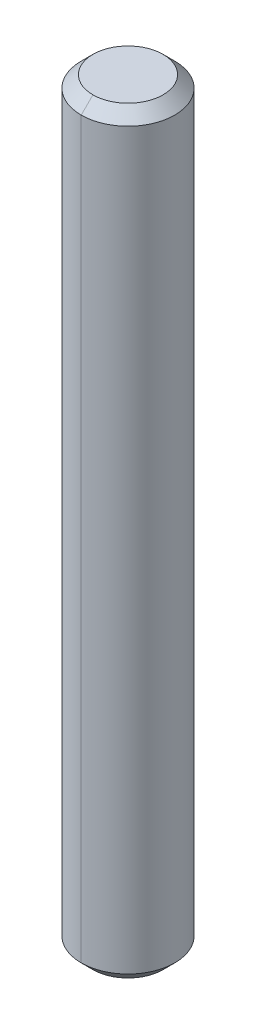
ISO-10303-21;
HEADER;
FILE_DESCRIPTION(('STEP AP214'),'2;1');
FILE_NAME('part.step','',(''),(''),'','','');
FILE_SCHEMA(('AUTOMOTIVE_DESIGN { 1 0 10303 214 1 1 1 1 }'));
ENDSEC;
DATA;
#1=APPLICATION_CONTEXT('core data for automotive mechanical design processes');
#2=APPLICATION_PROTOCOL_DEFINITION('international standard','automotive_design',2000,#1);
#3=PRODUCT_CONTEXT('',#1,'mechanical');
#4=PRODUCT('Part','Part','',(#3));
#5=PRODUCT_RELATED_PRODUCT_CATEGORY('part','',(#4));
#6=PRODUCT_DEFINITION_FORMATION('','',#4);
#7=PRODUCT_DEFINITION_CONTEXT('part definition',#1,'design');
#8=PRODUCT_DEFINITION('design','',#6,#7);
#9=PRODUCT_DEFINITION_SHAPE('','',#8);
#10=(LENGTH_UNIT() NAMED_UNIT(*) SI_UNIT(.MILLI.,.METRE.));
#11=(NAMED_UNIT(*) PLANE_ANGLE_UNIT() SI_UNIT($,.RADIAN.));
#12=(NAMED_UNIT(*) SI_UNIT($,.STERADIAN.) SOLID_ANGLE_UNIT());
#13=UNCERTAINTY_MEASURE_WITH_UNIT(LENGTH_MEASURE(1.E-05),#10,'distance_accuracy_value','');
#14=(GEOMETRIC_REPRESENTATION_CONTEXT(3) GLOBAL_UNCERTAINTY_ASSIGNED_CONTEXT((#13)) GLOBAL_UNIT_ASSIGNED_CONTEXT((#10,
#11,#12)) REPRESENTATION_CONTEXT('',''));
#15=CARTESIAN_POINT('',(0.,0.,0.));
#16=DIRECTION('',(0.,0.,1.));
#17=DIRECTION('',(1.,0.,0.));
#18=AXIS2_PLACEMENT_3D('',#15,#16,#17);
#19=CARTESIAN_POINT('',(0.,16.2,0.));
#20=DIRECTION('',(0.,-1.,0.));
#21=DIRECTION('',(0.,0.,-1.));
#22=AXIS2_PLACEMENT_3D('',#19,#20,#21);
#23=PLANE('',#22);
#24=CARTESIAN_POINT('',(0.,16.2,0.));
#25=DIRECTION('',(0.,-1.,0.));
#26=DIRECTION('',(0.,0.,-1.));
#27=AXIS2_PLACEMENT_3D('',#24,#25,#26);
#28=CIRCLE('',#27,1.5);
#29=CARTESIAN_POINT('',(0.,16.2,1.5));
#30=VERTEX_POINT('',#29);
#31=CARTESIAN_POINT('',(0.,16.2,-1.5));
#32=VERTEX_POINT('',#31);
#33=EDGE_CURVE('E10',#30,#32,#28,.T.);
#34=ORIENTED_EDGE('',*,*,#33,.F.);
#35=CARTESIAN_POINT('',(0.,16.2,0.));
#36=DIRECTION('',(0.,-1.,0.));
#37=DIRECTION('',(0.,0.,-1.));
#38=AXIS2_PLACEMENT_3D('',#35,#36,#37);
#39=CIRCLE('',#38,1.5);
#40=EDGE_CURVE('E24',#32,#30,#39,.T.);
#41=ORIENTED_EDGE('',*,*,#40,.F.);
#42=EDGE_LOOP('',(#34,#41));
#43=FACE_BOUND('',#42,.T.);
#44=ADVANCED_FACE('F16',(#43),#23,.F.);
#45=CARTESIAN_POINT('',(0.,16.2,0.));
#46=DIRECTION('',(0.,-1.,0.));
#47=DIRECTION('',(-1.,0.,0.));
#48=AXIS2_PLACEMENT_3D('',#45,#46,#47);
#49=CONICAL_SURFACE('',#48,1.5,0.785398163397448);
#50=DIRECTION('',(0.,-0.707106781186548,0.707106781186547));
#51=VECTOR('',#50,1.);
#52=CARTESIAN_POINT('',(0.,16.2,1.5));
#53=LINE('',#52,#51);
#54=CARTESIAN_POINT('',(0.,15.7,2.));
#55=VERTEX_POINT('',#54);
#56=EDGE_CURVE('E110',#30,#55,#53,.T.);
#57=ORIENTED_EDGE('',*,*,#56,.T.);
#58=CARTESIAN_POINT('',(0.,15.7,0.));
#59=DIRECTION('',(0.,-1.,0.));
#60=DIRECTION('',(0.,0.,-1.));
#61=AXIS2_PLACEMENT_3D('',#58,#59,#60);
#62=CIRCLE('',#61,2.);
#63=CARTESIAN_POINT('',(0.,15.7,-2.));
#64=VERTEX_POINT('',#63);
#65=EDGE_CURVE('E105',#64,#55,#62,.T.);
#66=ORIENTED_EDGE('',*,*,#65,.F.);
#67=DIRECTION('',(0.,-0.707106781186548,-0.707106781186547));
#68=VECTOR('',#67,1.);
#69=CARTESIAN_POINT('',(0.,16.2,-1.5));
#70=LINE('',#69,#68);
#71=EDGE_CURVE('E100',#32,#64,#70,.T.);
#72=ORIENTED_EDGE('',*,*,#71,.F.);
#73=ORIENTED_EDGE('',*,*,#40,.T.);
#74=EDGE_LOOP('',(#57,#66,#72,#73));
#75=FACE_BOUND('',#74,.T.);
#76=ADVANCED_FACE('F119',(#75),#49,.T.);
#77=CARTESIAN_POINT('',(0.,16.2,0.));
#78=DIRECTION('',(0.,-1.,0.));
#79=DIRECTION('',(1.,0.,0.));
#80=AXIS2_PLACEMENT_3D('',#77,#78,#79);
#81=CONICAL_SURFACE('',#80,1.5,0.785398163397448);
#82=ORIENTED_EDGE('',*,*,#56,.F.);
#83=ORIENTED_EDGE('',*,*,#33,.T.);
#84=ORIENTED_EDGE('',*,*,#71,.T.);
#85=CARTESIAN_POINT('',(0.,15.7,0.));
#86=DIRECTION('',(0.,-1.,0.));
#87=DIRECTION('',(0.,0.,-1.));
#88=AXIS2_PLACEMENT_3D('',#85,#86,#87);
#89=CIRCLE('',#88,2.);
#90=EDGE_CURVE('E95',#55,#64,#89,.T.);
#91=ORIENTED_EDGE('',*,*,#90,.F.);
#92=EDGE_LOOP('',(#82,#83,#84,#91));
#93=FACE_BOUND('',#92,.T.);
#94=ADVANCED_FACE('F122',(#93),#81,.T.);
#95=CARTESIAN_POINT('',(0.,-16.2,0.));
#96=DIRECTION('',(0.,-1.,0.));
#97=DIRECTION('',(1.,0.,0.));
#98=AXIS2_PLACEMENT_3D('',#95,#96,#97);
#99=CYLINDRICAL_SURFACE('',#98,2.);
#100=DIRECTION('',(0.,-1.,0.));
#101=VECTOR('',#100,1.);
#102=CARTESIAN_POINT('',(0.,15.7,2.));
#103=LINE('',#102,#101);
#104=CARTESIAN_POINT('',(0.,-15.7,2.));
#105=VERTEX_POINT('',#104);
#106=EDGE_CURVE('E90',#55,#105,#103,.T.);
#107=ORIENTED_EDGE('',*,*,#106,.F.);
#108=ORIENTED_EDGE('',*,*,#90,.T.);
#109=DIRECTION('',(0.,-1.,0.));
#110=VECTOR('',#109,1.);
#111=CARTESIAN_POINT('',(0.,15.7,-2.));
#112=LINE('',#111,#110);
#113=CARTESIAN_POINT('',(0.,-15.7,-2.));
#114=VERTEX_POINT('',#113);
#115=EDGE_CURVE('E86',#64,#114,#112,.T.);
#116=ORIENTED_EDGE('',*,*,#115,.T.);
#117=CARTESIAN_POINT('',(0.,-15.7,0.));
#118=DIRECTION('',(0.,-1.,0.));
#119=DIRECTION('',(0.,0.,-1.));
#120=AXIS2_PLACEMENT_3D('',#117,#118,#119);
#121=CIRCLE('',#120,2.);
#122=EDGE_CURVE('E82',#105,#114,#121,.T.);
#123=ORIENTED_EDGE('',*,*,#122,.F.);
#124=EDGE_LOOP('',(#107,#108,#116,#123));
#125=FACE_BOUND('',#124,.T.);
#126=ADVANCED_FACE('F126',(#125),#99,.T.);
#127=CARTESIAN_POINT('',(0.,-15.7,0.));
#128=DIRECTION('',(0.,1.,0.));
#129=DIRECTION('',(1.,0.,0.));
#130=AXIS2_PLACEMENT_3D('',#127,#128,#129);
#131=CONICAL_SURFACE('',#130,2.,0.785398163397448);
#132=DIRECTION('',(0.,0.707106781186548,-0.707106781186547));
#133=VECTOR('',#132,1.);
#134=CARTESIAN_POINT('',(0.,-16.2,-1.5));
#135=LINE('',#134,#133);
#136=CARTESIAN_POINT('',(0.,-16.2,-1.5));
#137=VERTEX_POINT('',#136);
#138=EDGE_CURVE('E60',#137,#114,#135,.T.);
#139=ORIENTED_EDGE('',*,*,#138,.F.);
#140=CARTESIAN_POINT('',(0.,-16.2,0.));
#141=DIRECTION('',(0.,-1.,0.));
#142=DIRECTION('',(0.,0.,-1.));
#143=AXIS2_PLACEMENT_3D('',#140,#141,#142);
#144=CIRCLE('',#143,1.5);
#145=CARTESIAN_POINT('',(0.,-16.2,1.5));
#146=VERTEX_POINT('',#145);
#147=EDGE_CURVE('E53',#146,#137,#144,.T.);
#148=ORIENTED_EDGE('',*,*,#147,.F.);
#149=DIRECTION('',(0.,0.707106781186548,0.707106781186547));
#150=VECTOR('',#149,1.);
#151=CARTESIAN_POINT('',(0.,-16.2,1.5));
#152=LINE('',#151,#150);
#153=EDGE_CURVE('E58',#146,#105,#152,.T.);
#154=ORIENTED_EDGE('',*,*,#153,.T.);
#155=ORIENTED_EDGE('',*,*,#122,.T.);
#156=EDGE_LOOP('',(#139,#148,#154,#155));
#157=FACE_BOUND('',#156,.T.);
#158=ADVANCED_FACE('F55',(#157),#131,.T.);
#159=CARTESIAN_POINT('',(0.,-15.7,0.));
#160=DIRECTION('',(0.,1.,0.));
#161=DIRECTION('',(-1.,0.,0.));
#162=AXIS2_PLACEMENT_3D('',#159,#160,#161);
#163=CONICAL_SURFACE('',#162,2.,0.785398163397448);
#164=ORIENTED_EDGE('',*,*,#138,.T.);
#165=CARTESIAN_POINT('',(0.,-15.7,0.));
#166=DIRECTION('',(0.,-1.,0.));
#167=DIRECTION('',(0.,0.,-1.));
#168=AXIS2_PLACEMENT_3D('',#165,#166,#167);
#169=CIRCLE('',#168,2.);
#170=EDGE_CURVE('E67',#114,#105,#169,.T.);
#171=ORIENTED_EDGE('',*,*,#170,.T.);
#172=ORIENTED_EDGE('',*,*,#153,.F.);
#173=CARTESIAN_POINT('',(0.,-16.2,0.));
#174=DIRECTION('',(0.,-1.,0.));
#175=DIRECTION('',(0.,0.,-1.));
#176=AXIS2_PLACEMENT_3D('',#173,#174,#175);
#177=CIRCLE('',#176,1.5);
#178=EDGE_CURVE('E64',#137,#146,#177,.T.);
#179=ORIENTED_EDGE('',*,*,#178,.F.);
#180=EDGE_LOOP('',(#164,#171,#172,#179));
#181=FACE_BOUND('',#180,.T.);
#182=ADVANCED_FACE('F70',(#181),#163,.T.);
#183=CARTESIAN_POINT('',(1.5,-16.2,0.));
#184=DIRECTION('',(0.,1.,0.));
#185=DIRECTION('',(0.,0.,1.));
#186=AXIS2_PLACEMENT_3D('',#183,#184,#185);
#187=PLANE('',#186);
#188=ORIENTED_EDGE('',*,*,#178,.T.);
#189=ORIENTED_EDGE('',*,*,#147,.T.);
#190=EDGE_LOOP('',(#188,#189));
#191=FACE_BOUND('',#190,.T.);
#192=ADVANCED_FACE('F65',(#191),#187,.F.);
#193=CARTESIAN_POINT('',(0.,-16.2,0.));
#194=DIRECTION('',(0.,-1.,0.));
#195=DIRECTION('',(-1.,0.,0.));
#196=AXIS2_PLACEMENT_3D('',#193,#194,#195);
#197=CYLINDRICAL_SURFACE('',#196,2.);
#198=ORIENTED_EDGE('',*,*,#106,.T.);
#199=ORIENTED_EDGE('',*,*,#170,.F.);
#200=ORIENTED_EDGE('',*,*,#115,.F.);
#201=ORIENTED_EDGE('',*,*,#65,.T.);
#202=EDGE_LOOP('',(#198,#199,#200,#201));
#203=FACE_BOUND('',#202,.T.);
#204=ADVANCED_FACE('F128',(#203),#197,.T.);
#205=CLOSED_SHELL('',(#44,#76,#94,#126,#158,#182,#192,#204));
#206=MANIFOLD_SOLID_BREP('B1',#205);
#207=ADVANCED_BREP_SHAPE_REPRESENTATION('',(#18,#206),#14);
#208=SHAPE_DEFINITION_REPRESENTATION(#9,#207);
ENDSEC;
END-ISO-10303-21;
